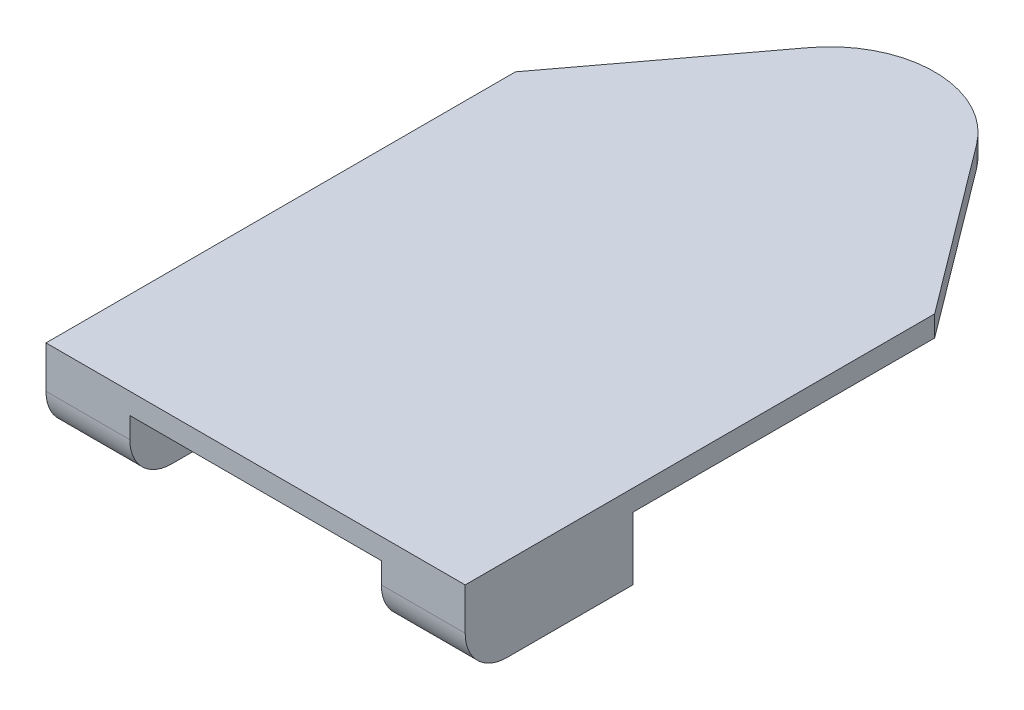
ISO-10303-21;
HEADER;
FILE_DESCRIPTION(('STEP AP214'),'2;1');
FILE_NAME('part.step','',(''),(''),'','','');
FILE_SCHEMA(('AUTOMOTIVE_DESIGN { 1 0 10303 214 1 1 1 1 }'));
ENDSEC;
DATA;
#1=APPLICATION_CONTEXT('core data for automotive mechanical design processes');
#2=APPLICATION_PROTOCOL_DEFINITION('international standard','automotive_design',2000,#1);
#3=PRODUCT_CONTEXT('',#1,'mechanical');
#4=PRODUCT('Part','Part','',(#3));
#5=PRODUCT_RELATED_PRODUCT_CATEGORY('part','',(#4));
#6=PRODUCT_DEFINITION_FORMATION('','',#4);
#7=PRODUCT_DEFINITION_CONTEXT('part definition',#1,'design');
#8=PRODUCT_DEFINITION('design','',#6,#7);
#9=PRODUCT_DEFINITION_SHAPE('','',#8);
#10=(LENGTH_UNIT() NAMED_UNIT(*) SI_UNIT(.MILLI.,.METRE.));
#11=(NAMED_UNIT(*) PLANE_ANGLE_UNIT() SI_UNIT($,.RADIAN.));
#12=(NAMED_UNIT(*) SI_UNIT($,.STERADIAN.) SOLID_ANGLE_UNIT());
#13=UNCERTAINTY_MEASURE_WITH_UNIT(LENGTH_MEASURE(1.E-05),#10,'distance_accuracy_value','');
#14=(GEOMETRIC_REPRESENTATION_CONTEXT(3) GLOBAL_UNCERTAINTY_ASSIGNED_CONTEXT((#13)) GLOBAL_UNIT_ASSIGNED_CONTEXT((#10,
#11,#12)) REPRESENTATION_CONTEXT('',''));
#15=CARTESIAN_POINT('',(0.,0.,0.));
#16=DIRECTION('',(0.,0.,1.));
#17=DIRECTION('',(1.,0.,0.));
#18=AXIS2_PLACEMENT_3D('',#15,#16,#17);
#19=CARTESIAN_POINT('',(50.,0.,-137.));
#20=DIRECTION('',(0.,-1.,0.));
#21=DIRECTION('',(0.,0.,-1.));
#22=AXIS2_PLACEMENT_3D('',#19,#20,#21);
#23=PLANE('',#22);
#24=DIRECTION('',(0.,0.,1.));
#25=VECTOR('',#24,1.);
#26=CARTESIAN_POINT('',(20.,0.,0.));
#27=LINE('',#26,#25);
#28=CARTESIAN_POINT('',(20.,0.,-40.));
#29=VERTEX_POINT('',#28);
#30=CARTESIAN_POINT('',(20.,0.,0.));
#31=VERTEX_POINT('',#30);
#32=EDGE_CURVE('E152',#29,#31,#27,.T.);
#33=ORIENTED_EDGE('',*,*,#32,.F.);
#34=DIRECTION('',(1.,0.,0.));
#35=VECTOR('',#34,1.);
#36=CARTESIAN_POINT('',(0.,0.,-40.));
#37=LINE('',#36,#35);
#38=CARTESIAN_POINT('',(0.,0.,-40.));
#39=VERTEX_POINT('',#38);
#40=EDGE_CURVE('E140',#39,#29,#37,.T.);
#41=ORIENTED_EDGE('',*,*,#40,.F.);
#42=DIRECTION('',(0.,0.,1.));
#43=VECTOR('',#42,1.);
#44=CARTESIAN_POINT('',(0.,0.,-112.));
#45=LINE('',#44,#43);
#46=CARTESIAN_POINT('',(0.,0.,-112.));
#47=VERTEX_POINT('',#46);
#48=EDGE_CURVE('E191',#47,#39,#45,.T.);
#49=ORIENTED_EDGE('',*,*,#48,.F.);
#50=DIRECTION('',(-0.6,0.,0.8));
#51=VECTOR('',#50,1.);
#52=CARTESIAN_POINT('',(30.,0.,-152.));
#53=LINE('',#52,#51);
#54=CARTESIAN_POINT('',(30.,0.,-152.));
#55=VERTEX_POINT('',#54);
#56=EDGE_CURVE('E196',#55,#47,#53,.T.);
#57=ORIENTED_EDGE('',*,*,#56,.F.);
#58=CARTESIAN_POINT('',(50.,0.,-137.));
#59=DIRECTION('',(0.,1.,0.));
#60=DIRECTION('',(0.,0.,-1.));
#61=AXIS2_PLACEMENT_3D('',#58,#59,#60);
#62=CIRCLE('',#61,25.);
#63=CARTESIAN_POINT('',(70.,0.,-152.));
#64=VERTEX_POINT('',#63);
#65=EDGE_CURVE('E213',#64,#55,#62,.T.);
#66=ORIENTED_EDGE('',*,*,#65,.F.);
#67=DIRECTION('',(-0.6,0.,-0.8));
#68=VECTOR('',#67,1.);
#69=CARTESIAN_POINT('',(100.,0.,-112.));
#70=LINE('',#69,#68);
#71=CARTESIAN_POINT('',(100.,0.,-112.));
#72=VERTEX_POINT('',#71);
#73=EDGE_CURVE('E211',#72,#64,#70,.T.);
#74=ORIENTED_EDGE('',*,*,#73,.F.);
#75=DIRECTION('',(0.,0.,-1.));
#76=VECTOR('',#75,1.);
#77=CARTESIAN_POINT('',(100.,0.,0.));
#78=LINE('',#77,#76);
#79=CARTESIAN_POINT('',(100.,0.,-40.));
#80=VERTEX_POINT('',#79);
#81=EDGE_CURVE('E209',#80,#72,#78,.T.);
#82=ORIENTED_EDGE('',*,*,#81,.F.);
#83=DIRECTION('',(1.,0.,0.));
#84=VECTOR('',#83,1.);
#85=CARTESIAN_POINT('',(100.,0.,-40.));
#86=LINE('',#85,#84);
#87=CARTESIAN_POINT('',(80.,0.,-40.));
#88=VERTEX_POINT('',#87);
#89=EDGE_CURVE('E175',#88,#80,#86,.T.);
#90=ORIENTED_EDGE('',*,*,#89,.F.);
#91=DIRECTION('',(0.,0.,-1.));
#92=VECTOR('',#91,1.);
#93=CARTESIAN_POINT('',(80.,0.,0.));
#94=LINE('',#93,#92);
#95=CARTESIAN_POINT('',(80.,0.,0.));
#96=VERTEX_POINT('',#95);
#97=EDGE_CURVE('E151',#96,#88,#94,.T.);
#98=ORIENTED_EDGE('',*,*,#97,.F.);
#99=DIRECTION('',(1.,0.,0.));
#100=VECTOR('',#99,1.);
#101=CARTESIAN_POINT('',(0.,0.,0.));
#102=LINE('',#101,#100);
#103=EDGE_CURVE('E162',#31,#96,#102,.T.);
#104=ORIENTED_EDGE('',*,*,#103,.F.);
#105=EDGE_LOOP('',(#33,#41,#49,#57,#66,#74,#82,#90,#98,#104));
#106=FACE_BOUND('',#105,.T.);
#107=ADVANCED_FACE('F39',(#106),#23,.T.);
#108=CARTESIAN_POINT('',(0.,5.,-112.));
#109=DIRECTION('',(1.,0.,0.));
#110=DIRECTION('',(0.,0.,-1.));
#111=AXIS2_PLACEMENT_3D('',#108,#109,#110);
#112=PLANE('',#111);
#113=DIRECTION('',(0.,0.,-1.));
#114=VECTOR('',#113,1.);
#115=CARTESIAN_POINT('',(0.,-15.,0.));
#116=LINE('',#115,#114);
#117=CARTESIAN_POINT('',(0.,-15.,-10.));
#118=VERTEX_POINT('',#117);
#119=CARTESIAN_POINT('',(0.,-15.,-40.));
#120=VERTEX_POINT('',#119);
#121=EDGE_CURVE('E163',#118,#120,#116,.T.);
#122=ORIENTED_EDGE('',*,*,#121,.F.);
#123=CARTESIAN_POINT('',(0.,-5.,-10.));
#124=DIRECTION('',(1.,0.,0.));
#125=DIRECTION('',(0.,0.,-1.));
#126=AXIS2_PLACEMENT_3D('',#123,#124,#125);
#127=CIRCLE('',#126,10.);
#128=CARTESIAN_POINT('',(0.,-5.,0.));
#129=VERTEX_POINT('',#128);
#130=EDGE_CURVE('E47',#118,#129,#127,.F.);
#131=ORIENTED_EDGE('',*,*,#130,.T.);
#132=DIRECTION('',(0.,-1.,0.));
#133=VECTOR('',#132,1.);
#134=CARTESIAN_POINT('',(0.,5.,0.));
#135=LINE('',#134,#133);
#136=CARTESIAN_POINT('',(0.,5.,0.));
#137=VERTEX_POINT('',#136);
#138=EDGE_CURVE('E230',#137,#129,#135,.T.);
#139=ORIENTED_EDGE('',*,*,#138,.F.);
#140=DIRECTION('',(0.,0.,1.));
#141=VECTOR('',#140,1.);
#142=CARTESIAN_POINT('',(0.,5.,-112.));
#143=LINE('',#142,#141);
#144=CARTESIAN_POINT('',(0.,5.,-112.));
#145=VERTEX_POINT('',#144);
#146=EDGE_CURVE('E192',#145,#137,#143,.T.);
#147=ORIENTED_EDGE('',*,*,#146,.F.);
#148=DIRECTION('',(0.,-1.,0.));
#149=VECTOR('',#148,1.);
#150=CARTESIAN_POINT('',(0.,5.,-112.));
#151=LINE('',#150,#149);
#152=EDGE_CURVE('E206',#145,#47,#151,.T.);
#153=ORIENTED_EDGE('',*,*,#152,.T.);
#154=ORIENTED_EDGE('',*,*,#48,.T.);
#155=DIRECTION('',(0.,1.,0.));
#156=VECTOR('',#155,1.);
#157=CARTESIAN_POINT('',(0.,-15.,-40.));
#158=LINE('',#157,#156);
#159=EDGE_CURVE('E146',#120,#39,#158,.T.);
#160=ORIENTED_EDGE('',*,*,#159,.F.);
#161=EDGE_LOOP('',(#122,#131,#139,#147,#153,#154,#160));
#162=FACE_BOUND('',#161,.T.);
#163=ADVANCED_FACE('F248',(#162),#112,.F.);
#164=CARTESIAN_POINT('',(0.,5.,0.));
#165=DIRECTION('',(0.,0.,-1.));
#166=DIRECTION('',(-1.,0.,0.));
#167=AXIS2_PLACEMENT_3D('',#164,#165,#166);
#168=PLANE('',#167);
#169=DIRECTION('',(0.,1.,0.));
#170=VECTOR('',#169,1.);
#171=CARTESIAN_POINT('',(80.,-15.,0.));
#172=LINE('',#171,#170);
#173=CARTESIAN_POINT('',(80.,-5.,0.));
#174=VERTEX_POINT('',#173);
#175=EDGE_CURVE('E189',#174,#96,#172,.T.);
#176=ORIENTED_EDGE('',*,*,#175,.F.);
#177=DIRECTION('',(-1.,0.,0.));
#178=VECTOR('',#177,1.);
#179=CARTESIAN_POINT('',(0.,-5.,0.));
#180=LINE('',#179,#178);
#181=CARTESIAN_POINT('',(100.,-5.,0.));
#182=VERTEX_POINT('',#181);
#183=EDGE_CURVE('E240',#174,#182,#180,.F.);
#184=ORIENTED_EDGE('',*,*,#183,.T.);
#185=DIRECTION('',(0.,-1.,0.));
#186=VECTOR('',#185,1.);
#187=CARTESIAN_POINT('',(100.,5.,0.));
#188=LINE('',#187,#186);
#189=CARTESIAN_POINT('',(100.,5.,0.));
#190=VERTEX_POINT('',#189);
#191=EDGE_CURVE('E227',#190,#182,#188,.T.);
#192=ORIENTED_EDGE('',*,*,#191,.F.);
#193=DIRECTION('',(1.,0.,0.));
#194=VECTOR('',#193,1.);
#195=CARTESIAN_POINT('',(0.,5.,0.));
#196=LINE('',#195,#194);
#197=EDGE_CURVE('E195',#137,#190,#196,.T.);
#198=ORIENTED_EDGE('',*,*,#197,.F.);
#199=ORIENTED_EDGE('',*,*,#138,.T.);
#200=DIRECTION('',(-1.,0.,0.));
#201=VECTOR('',#200,1.);
#202=CARTESIAN_POINT('',(20.,-5.,0.));
#203=LINE('',#202,#201);
#204=CARTESIAN_POINT('',(20.,-5.,0.));
#205=VERTEX_POINT('',#204);
#206=EDGE_CURVE('E238',#129,#205,#203,.F.);
#207=ORIENTED_EDGE('',*,*,#206,.T.);
#208=DIRECTION('',(0.,1.,0.));
#209=VECTOR('',#208,1.);
#210=CARTESIAN_POINT('',(20.,-15.,0.));
#211=LINE('',#210,#209);
#212=EDGE_CURVE('E158',#205,#31,#211,.T.);
#213=ORIENTED_EDGE('',*,*,#212,.T.);
#214=ORIENTED_EDGE('',*,*,#103,.T.);
#215=EDGE_LOOP('',(#176,#184,#192,#198,#199,#207,#213,#214));
#216=FACE_BOUND('',#215,.T.);
#217=ADVANCED_FACE('F252',(#216),#168,.F.);
#218=CARTESIAN_POINT('',(100.,5.,0.));
#219=DIRECTION('',(-1.,0.,0.));
#220=DIRECTION('',(0.,0.,1.));
#221=AXIS2_PLACEMENT_3D('',#218,#219,#220);
#222=PLANE('',#221);
#223=ORIENTED_EDGE('',*,*,#191,.T.);
#224=CARTESIAN_POINT('',(100.,-5.,-10.));
#225=DIRECTION('',(-1.,0.,0.));
#226=DIRECTION('',(0.,0.,1.));
#227=AXIS2_PLACEMENT_3D('',#224,#225,#226);
#228=CIRCLE('',#227,10.);
#229=CARTESIAN_POINT('',(100.,-15.,-10.));
#230=VERTEX_POINT('',#229);
#231=EDGE_CURVE('E242',#182,#230,#228,.F.);
#232=ORIENTED_EDGE('',*,*,#231,.T.);
#233=DIRECTION('',(0.,0.,1.));
#234=VECTOR('',#233,1.);
#235=CARTESIAN_POINT('',(100.,-15.,0.));
#236=LINE('',#235,#234);
#237=CARTESIAN_POINT('',(100.,-15.,-40.));
#238=VERTEX_POINT('',#237);
#239=EDGE_CURVE('E171',#238,#230,#236,.T.);
#240=ORIENTED_EDGE('',*,*,#239,.F.);
#241=DIRECTION('',(0.,1.,0.));
#242=VECTOR('',#241,1.);
#243=CARTESIAN_POINT('',(100.,-15.,-40.));
#244=LINE('',#243,#242);
#245=EDGE_CURVE('E179',#238,#80,#244,.T.);
#246=ORIENTED_EDGE('',*,*,#245,.T.);
#247=ORIENTED_EDGE('',*,*,#81,.T.);
#248=DIRECTION('',(0.,-1.,0.));
#249=VECTOR('',#248,1.);
#250=CARTESIAN_POINT('',(100.,5.,-112.));
#251=LINE('',#250,#249);
#252=CARTESIAN_POINT('',(100.,5.,-112.));
#253=VERTEX_POINT('',#252);
#254=EDGE_CURVE('E224',#253,#72,#251,.T.);
#255=ORIENTED_EDGE('',*,*,#254,.F.);
#256=DIRECTION('',(0.,0.,-1.));
#257=VECTOR('',#256,1.);
#258=CARTESIAN_POINT('',(100.,5.,0.));
#259=LINE('',#258,#257);
#260=EDGE_CURVE('E198',#190,#253,#259,.T.);
#261=ORIENTED_EDGE('',*,*,#260,.F.);
#262=EDGE_LOOP('',(#223,#232,#240,#246,#247,#255,#261));
#263=FACE_BOUND('',#262,.T.);
#264=ADVANCED_FACE('F280',(#263),#222,.F.);
#265=CARTESIAN_POINT('',(100.,5.,-112.));
#266=DIRECTION('',(-0.8,0.,0.6));
#267=DIRECTION('',(0.6,0.,0.8));
#268=AXIS2_PLACEMENT_3D('',#265,#266,#267);
#269=PLANE('',#268);
#270=ORIENTED_EDGE('',*,*,#73,.T.);
#271=DIRECTION('',(0.,-1.,0.));
#272=VECTOR('',#271,1.);
#273=CARTESIAN_POINT('',(70.,5.,-152.));
#274=LINE('',#273,#272);
#275=CARTESIAN_POINT('',(70.,5.,-152.));
#276=VERTEX_POINT('',#275);
#277=EDGE_CURVE('E221',#276,#64,#274,.T.);
#278=ORIENTED_EDGE('',*,*,#277,.F.);
#279=DIRECTION('',(-0.6,0.,-0.8));
#280=VECTOR('',#279,1.);
#281=CARTESIAN_POINT('',(100.,5.,-112.));
#282=LINE('',#281,#280);
#283=EDGE_CURVE('E200',#253,#276,#282,.T.);
#284=ORIENTED_EDGE('',*,*,#283,.F.);
#285=ORIENTED_EDGE('',*,*,#254,.T.);
#286=EDGE_LOOP('',(#270,#278,#284,#285));
#287=FACE_BOUND('',#286,.T.);
#288=ADVANCED_FACE('F271',(#287),#269,.F.);
#289=CARTESIAN_POINT('',(50.,5.,-137.));
#290=DIRECTION('',(0.,-1.,0.));
#291=DIRECTION('',(0.,0.,-1.));
#292=AXIS2_PLACEMENT_3D('',#289,#290,#291);
#293=CYLINDRICAL_SURFACE('',#292,25.);
#294=ORIENTED_EDGE('',*,*,#65,.T.);
#295=DIRECTION('',(0.,-1.,0.));
#296=VECTOR('',#295,1.);
#297=CARTESIAN_POINT('',(30.,5.,-152.));
#298=LINE('',#297,#296);
#299=CARTESIAN_POINT('',(30.,5.,-152.));
#300=VERTEX_POINT('',#299);
#301=EDGE_CURVE('E218',#300,#55,#298,.T.);
#302=ORIENTED_EDGE('',*,*,#301,.F.);
#303=CARTESIAN_POINT('',(50.,5.,-137.));
#304=DIRECTION('',(0.,1.,0.));
#305=DIRECTION('',(0.,0.,-1.));
#306=AXIS2_PLACEMENT_3D('',#303,#304,#305);
#307=CIRCLE('',#306,25.);
#308=EDGE_CURVE('E202',#276,#300,#307,.T.);
#309=ORIENTED_EDGE('',*,*,#308,.F.);
#310=ORIENTED_EDGE('',*,*,#277,.T.);
#311=EDGE_LOOP('',(#294,#302,#309,#310));
#312=FACE_BOUND('',#311,.T.);
#313=ADVANCED_FACE('F267',(#312),#293,.T.);
#314=CARTESIAN_POINT('',(30.,5.,-152.));
#315=DIRECTION('',(0.8,0.,0.6));
#316=DIRECTION('',(0.6,0.,-0.8));
#317=AXIS2_PLACEMENT_3D('',#314,#315,#316);
#318=PLANE('',#317);
#319=ORIENTED_EDGE('',*,*,#56,.T.);
#320=ORIENTED_EDGE('',*,*,#152,.F.);
#321=DIRECTION('',(-0.6,0.,0.8));
#322=VECTOR('',#321,1.);
#323=CARTESIAN_POINT('',(30.,5.,-152.));
#324=LINE('',#323,#322);
#325=EDGE_CURVE('E204',#300,#145,#324,.T.);
#326=ORIENTED_EDGE('',*,*,#325,.F.);
#327=ORIENTED_EDGE('',*,*,#301,.T.);
#328=EDGE_LOOP('',(#319,#320,#326,#327));
#329=FACE_BOUND('',#328,.T.);
#330=ADVANCED_FACE('F262',(#329),#318,.F.);
#331=CARTESIAN_POINT('',(50.,5.,-137.));
#332=DIRECTION('',(0.,-1.,0.));
#333=DIRECTION('',(0.,0.,-1.));
#334=AXIS2_PLACEMENT_3D('',#331,#332,#333);
#335=PLANE('',#334);
#336=ORIENTED_EDGE('',*,*,#146,.T.);
#337=ORIENTED_EDGE('',*,*,#197,.T.);
#338=ORIENTED_EDGE('',*,*,#260,.T.);
#339=ORIENTED_EDGE('',*,*,#283,.T.);
#340=ORIENTED_EDGE('',*,*,#308,.T.);
#341=ORIENTED_EDGE('',*,*,#325,.T.);
#342=EDGE_LOOP('',(#336,#337,#338,#339,#340,#341));
#343=FACE_BOUND('',#342,.T.);
#344=ADVANCED_FACE('F293',(#343),#335,.F.);
#345=CARTESIAN_POINT('',(80.,-15.,0.));
#346=DIRECTION('',(1.,0.,0.));
#347=DIRECTION('',(0.,0.,-1.));
#348=AXIS2_PLACEMENT_3D('',#345,#346,#347);
#349=PLANE('',#348);
#350=DIRECTION('',(0.,0.,-1.));
#351=VECTOR('',#350,1.);
#352=CARTESIAN_POINT('',(80.,-15.,0.));
#353=LINE('',#352,#351);
#354=CARTESIAN_POINT('',(80.,-15.,-10.));
#355=VERTEX_POINT('',#354);
#356=CARTESIAN_POINT('',(80.,-15.,-40.));
#357=VERTEX_POINT('',#356);
#358=EDGE_CURVE('E174',#355,#357,#353,.T.);
#359=ORIENTED_EDGE('',*,*,#358,.F.);
#360=CARTESIAN_POINT('',(80.,-5.,-10.));
#361=DIRECTION('',(1.,0.,0.));
#362=DIRECTION('',(0.,0.,-1.));
#363=AXIS2_PLACEMENT_3D('',#360,#361,#362);
#364=CIRCLE('',#363,10.);
#365=EDGE_CURVE('E236',#355,#174,#364,.F.);
#366=ORIENTED_EDGE('',*,*,#365,.T.);
#367=ORIENTED_EDGE('',*,*,#175,.T.);
#368=ORIENTED_EDGE('',*,*,#97,.T.);
#369=DIRECTION('',(0.,1.,0.));
#370=VECTOR('',#369,1.);
#371=CARTESIAN_POINT('',(80.,-15.,-40.));
#372=LINE('',#371,#370);
#373=EDGE_CURVE('E186',#357,#88,#372,.T.);
#374=ORIENTED_EDGE('',*,*,#373,.F.);
#375=EDGE_LOOP('',(#359,#366,#367,#368,#374));
#376=FACE_BOUND('',#375,.T.);
#377=ADVANCED_FACE('F290',(#376),#349,.F.);
#378=CARTESIAN_POINT('',(100.,-15.,-40.));
#379=DIRECTION('',(0.,0.,1.));
#380=DIRECTION('',(1.,0.,0.));
#381=AXIS2_PLACEMENT_3D('',#378,#379,#380);
#382=PLANE('',#381);
#383=ORIENTED_EDGE('',*,*,#89,.T.);
#384=ORIENTED_EDGE('',*,*,#245,.F.);
#385=DIRECTION('',(1.,0.,0.));
#386=VECTOR('',#385,1.);
#387=CARTESIAN_POINT('',(100.,-15.,-40.));
#388=LINE('',#387,#386);
#389=EDGE_CURVE('E177',#357,#238,#388,.T.);
#390=ORIENTED_EDGE('',*,*,#389,.F.);
#391=ORIENTED_EDGE('',*,*,#373,.T.);
#392=EDGE_LOOP('',(#383,#384,#390,#391));
#393=FACE_BOUND('',#392,.T.);
#394=ADVANCED_FACE('F276',(#393),#382,.F.);
#395=CARTESIAN_POINT('',(0.,-15.,0.));
#396=DIRECTION('',(0.,1.,0.));
#397=DIRECTION('',(0.,0.,1.));
#398=AXIS2_PLACEMENT_3D('',#395,#396,#397);
#399=PLANE('',#398);
#400=ORIENTED_EDGE('',*,*,#239,.T.);
#401=DIRECTION('',(-1.,0.,0.));
#402=VECTOR('',#401,1.);
#403=CARTESIAN_POINT('',(0.,-15.,-10.));
#404=LINE('',#403,#402);
#405=EDGE_CURVE('E233',#230,#355,#404,.T.);
#406=ORIENTED_EDGE('',*,*,#405,.T.);
#407=ORIENTED_EDGE('',*,*,#358,.T.);
#408=ORIENTED_EDGE('',*,*,#389,.T.);
#409=EDGE_LOOP('',(#400,#406,#407,#408));
#410=FACE_BOUND('',#409,.T.);
#411=ADVANCED_FACE('F284',(#410),#399,.F.);
#412=CARTESIAN_POINT('',(0.,-15.,-40.));
#413=DIRECTION('',(0.,0.,1.));
#414=DIRECTION('',(1.,0.,0.));
#415=AXIS2_PLACEMENT_3D('',#412,#413,#414);
#416=PLANE('',#415);
#417=ORIENTED_EDGE('',*,*,#40,.T.);
#418=DIRECTION('',(0.,1.,0.));
#419=VECTOR('',#418,1.);
#420=CARTESIAN_POINT('',(20.,-15.,-40.));
#421=LINE('',#420,#419);
#422=CARTESIAN_POINT('',(20.,-15.,-40.));
#423=VERTEX_POINT('',#422);
#424=EDGE_CURVE('E144',#423,#29,#421,.T.);
#425=ORIENTED_EDGE('',*,*,#424,.F.);
#426=DIRECTION('',(1.,0.,0.));
#427=VECTOR('',#426,1.);
#428=CARTESIAN_POINT('',(0.,-15.,-40.));
#429=LINE('',#428,#427);
#430=EDGE_CURVE('E165',#120,#423,#429,.T.);
#431=ORIENTED_EDGE('',*,*,#430,.F.);
#432=ORIENTED_EDGE('',*,*,#159,.T.);
#433=EDGE_LOOP('',(#417,#425,#431,#432));
#434=FACE_BOUND('',#433,.T.);
#435=ADVANCED_FACE('F142',(#434),#416,.F.);
#436=CARTESIAN_POINT('',(20.,-15.,0.));
#437=DIRECTION('',(-1.,0.,0.));
#438=DIRECTION('',(0.,0.,1.));
#439=AXIS2_PLACEMENT_3D('',#436,#437,#438);
#440=PLANE('',#439);
#441=ORIENTED_EDGE('',*,*,#212,.F.);
#442=CARTESIAN_POINT('',(20.,-5.,-10.));
#443=DIRECTION('',(-1.,0.,0.));
#444=DIRECTION('',(0.,0.,1.));
#445=AXIS2_PLACEMENT_3D('',#442,#443,#444);
#446=CIRCLE('',#445,10.);
#447=CARTESIAN_POINT('',(20.,-15.,-10.));
#448=VERTEX_POINT('',#447);
#449=EDGE_CURVE('E11',#205,#448,#446,.F.);
#450=ORIENTED_EDGE('',*,*,#449,.T.);
#451=DIRECTION('',(0.,0.,1.));
#452=VECTOR('',#451,1.);
#453=CARTESIAN_POINT('',(20.,-15.,0.));
#454=LINE('',#453,#452);
#455=EDGE_CURVE('E157',#423,#448,#454,.T.);
#456=ORIENTED_EDGE('',*,*,#455,.F.);
#457=ORIENTED_EDGE('',*,*,#424,.T.);
#458=ORIENTED_EDGE('',*,*,#32,.T.);
#459=EDGE_LOOP('',(#441,#450,#456,#457,#458));
#460=FACE_BOUND('',#459,.T.);
#461=ADVANCED_FACE('F155',(#460),#440,.F.);
#462=CARTESIAN_POINT('',(0.,-15.,0.));
#463=DIRECTION('',(0.,-1.,0.));
#464=DIRECTION('',(0.,0.,-1.));
#465=AXIS2_PLACEMENT_3D('',#462,#463,#464);
#466=PLANE('',#465);
#467=ORIENTED_EDGE('',*,*,#455,.T.);
#468=DIRECTION('',(-1.,0.,0.));
#469=VECTOR('',#468,1.);
#470=CARTESIAN_POINT('',(0.,-15.,-10.));
#471=LINE('',#470,#469);
#472=EDGE_CURVE('E244',#448,#118,#471,.T.);
#473=ORIENTED_EDGE('',*,*,#472,.T.);
#474=ORIENTED_EDGE('',*,*,#121,.T.);
#475=ORIENTED_EDGE('',*,*,#430,.T.);
#476=EDGE_LOOP('',(#467,#473,#474,#475));
#477=FACE_BOUND('',#476,.T.);
#478=ADVANCED_FACE('F255',(#477),#466,.T.);
#479=CARTESIAN_POINT('',(0.,-5.,-10.));
#480=DIRECTION('',(-1.,0.,0.));
#481=DIRECTION('',(0.,0.,1.));
#482=AXIS2_PLACEMENT_3D('',#479,#480,#481);
#483=CYLINDRICAL_SURFACE('',#482,10.);
#484=ORIENTED_EDGE('',*,*,#231,.F.);
#485=ORIENTED_EDGE('',*,*,#183,.F.);
#486=ORIENTED_EDGE('',*,*,#365,.F.);
#487=ORIENTED_EDGE('',*,*,#405,.F.);
#488=EDGE_LOOP('',(#484,#485,#486,#487));
#489=FACE_BOUND('',#488,.T.);
#490=ADVANCED_FACE('F287',(#489),#483,.T.);
#491=CARTESIAN_POINT('',(0.,-5.,-10.));
#492=DIRECTION('',(1.,0.,0.));
#493=DIRECTION('',(0.,0.,-1.));
#494=AXIS2_PLACEMENT_3D('',#491,#492,#493);
#495=CYLINDRICAL_SURFACE('',#494,10.);
#496=ORIENTED_EDGE('',*,*,#449,.F.);
#497=ORIENTED_EDGE('',*,*,#206,.F.);
#498=ORIENTED_EDGE('',*,*,#130,.F.);
#499=ORIENTED_EDGE('',*,*,#472,.F.);
#500=EDGE_LOOP('',(#496,#497,#498,#499));
#501=FACE_BOUND('',#500,.T.);
#502=ADVANCED_FACE('F41',(#501),#495,.T.);
#503=CLOSED_SHELL('',(#107,#163,#217,#264,#288,#313,#330,#344,#377,#394,#411,#435,#461,#478,
#490,#502));
#504=MANIFOLD_SOLID_BREP('B2',#503);
#505=ADVANCED_BREP_SHAPE_REPRESENTATION('',(#18,#504),#14);
#506=SHAPE_DEFINITION_REPRESENTATION(#9,#505);
ENDSEC;
END-ISO-10303-21;
